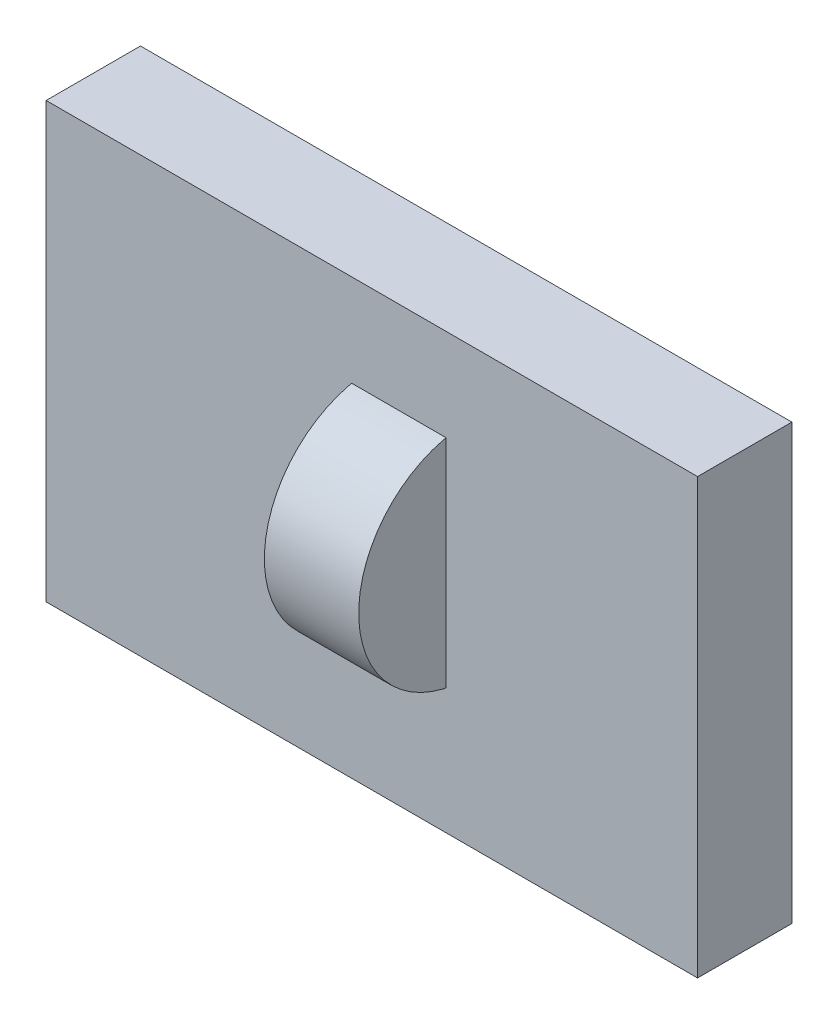
ISO-10303-21;
HEADER;
FILE_DESCRIPTION(('STEP AP214'),'2;1');
FILE_NAME('part.step','',(''),(''),'','','');
FILE_SCHEMA(('AUTOMOTIVE_DESIGN { 1 0 10303 214 1 1 1 1 }'));
ENDSEC;
DATA;
#1=APPLICATION_CONTEXT('core data for automotive mechanical design processes');
#2=APPLICATION_PROTOCOL_DEFINITION('international standard','automotive_design',2000,#1);
#3=PRODUCT_CONTEXT('',#1,'mechanical');
#4=PRODUCT('Part','Part','',(#3));
#5=PRODUCT_RELATED_PRODUCT_CATEGORY('part','',(#4));
#6=PRODUCT_DEFINITION_FORMATION('','',#4);
#7=PRODUCT_DEFINITION_CONTEXT('part definition',#1,'design');
#8=PRODUCT_DEFINITION('design','',#6,#7);
#9=PRODUCT_DEFINITION_SHAPE('','',#8);
#10=(LENGTH_UNIT() NAMED_UNIT(*) SI_UNIT(.MILLI.,.METRE.));
#11=(NAMED_UNIT(*) PLANE_ANGLE_UNIT() SI_UNIT($,.RADIAN.));
#12=(NAMED_UNIT(*) SI_UNIT($,.STERADIAN.) SOLID_ANGLE_UNIT());
#13=UNCERTAINTY_MEASURE_WITH_UNIT(LENGTH_MEASURE(1.E-05),#10,'distance_accuracy_value','');
#14=(GEOMETRIC_REPRESENTATION_CONTEXT(3) GLOBAL_UNCERTAINTY_ASSIGNED_CONTEXT((#13)) GLOBAL_UNIT_ASSIGNED_CONTEXT((#10,
#11,#12)) REPRESENTATION_CONTEXT('',''));
#15=CARTESIAN_POINT('',(0.,0.,0.));
#16=DIRECTION('',(0.,0.,1.));
#17=DIRECTION('',(1.,0.,0.));
#18=AXIS2_PLACEMENT_3D('',#15,#16,#17);
#19=CARTESIAN_POINT('',(10.,0.,-2.49777081928821));
#20=DIRECTION('',(-1.,0.,0.));
#21=DIRECTION('',(0.,0.,1.));
#22=AXIS2_PLACEMENT_3D('',#19,#20,#21);
#23=CYLINDRICAL_SURFACE('',#22,11.76735074313);
#24=CARTESIAN_POINT('',(10.,0.,-2.49777081928821));
#25=DIRECTION('',(1.,0.,0.));
#26=DIRECTION('',(0.,0.,-1.));
#27=AXIS2_PLACEMENT_3D('',#24,#25,#26);
#28=CIRCLE('',#27,11.76735074313);
#29=CARTESIAN_POINT('',(10.,0.,-14.2651215624182));
#30=VERTEX_POINT('',#29);
#31=EDGE_CURVE('E11',#30,#30,#28,.T.);
#32=ORIENTED_EDGE('',*,*,#31,.F.);
#33=EDGE_LOOP('',(#32));
#34=FACE_BOUND('',#33,.T.);
#35=CARTESIAN_POINT('',(0.,0.,-2.49777081928821));
#36=DIRECTION('',(1.,0.,0.));
#37=DIRECTION('',(0.,0.,-1.));
#38=AXIS2_PLACEMENT_3D('',#35,#36,#37);
#39=CIRCLE('',#38,11.76735074313);
#40=CARTESIAN_POINT('',(0.,0.,-14.2651215624182));
#41=VERTEX_POINT('',#40);
#42=EDGE_CURVE('E47',#41,#41,#39,.T.);
#43=ORIENTED_EDGE('',*,*,#42,.T.);
#44=EDGE_LOOP('',(#43));
#45=FACE_BOUND('',#44,.T.);
#46=ADVANCED_FACE('F44',(#34,#45),#23,.T.);
#47=CARTESIAN_POINT('',(10.,0.,-2.49777081928821));
#48=DIRECTION('',(1.,0.,0.));
#49=DIRECTION('',(0.,0.,-1.));
#50=AXIS2_PLACEMENT_3D('',#47,#48,#49);
#51=PLANE('',#50);
#52=ORIENTED_EDGE('',*,*,#31,.T.);
#53=EDGE_LOOP('',(#52));
#54=FACE_BOUND('',#53,.T.);
#55=ADVANCED_FACE('F59',(#54),#51,.T.);
#56=CARTESIAN_POINT('',(0.,0.,-2.49777081928821));
#57=DIRECTION('',(1.,0.,0.));
#58=DIRECTION('',(0.,0.,-1.));
#59=AXIS2_PLACEMENT_3D('',#56,#57,#58);
#60=PLANE('',#59);
#61=ORIENTED_EDGE('',*,*,#42,.F.);
#62=EDGE_LOOP('',(#61));
#63=FACE_BOUND('',#62,.T.);
#64=ADVANCED_FACE('F57',(#63),#60,.F.);
#65=CLOSED_SHELL('',(#46,#55,#64));
#66=MANIFOLD_SOLID_BREP('B2',#65);
#67=CARTESIAN_POINT('',(-32.4073170430545,21.2506997003636,-10.));
#68=DIRECTION('',(-1.,0.,0.));
#69=DIRECTION('',(0.,0.,1.));
#70=AXIS2_PLACEMENT_3D('',#67,#68,#69);
#71=PLANE('',#70);
#72=DIRECTION('',(0.,-1.,0.));
#73=VECTOR('',#72,1.);
#74=CARTESIAN_POINT('',(-32.4073170430545,21.2506997003636,0.));
#75=LINE('',#74,#73);
#76=CARTESIAN_POINT('',(-32.4073170430545,21.2506997003636,0.));
#77=VERTEX_POINT('',#76);
#78=CARTESIAN_POINT('',(-32.4073170430545,-24.7924829837576,0.));
#79=VERTEX_POINT('',#78);
#80=EDGE_CURVE('E148',#77,#79,#75,.T.);
#81=ORIENTED_EDGE('',*,*,#80,.F.);
#82=DIRECTION('',(0.,0.,1.));
#83=VECTOR('',#82,1.);
#84=CARTESIAN_POINT('',(-32.4073170430545,21.2506997003636,-10.));
#85=LINE('',#84,#83);
#86=CARTESIAN_POINT('',(-32.4073170430545,21.2506997003636,-10.));
#87=VERTEX_POINT('',#86);
#88=EDGE_CURVE('E42',#87,#77,#85,.T.);
#89=ORIENTED_EDGE('',*,*,#88,.F.);
#90=DIRECTION('',(0.,-1.,0.));
#91=VECTOR('',#90,1.);
#92=CARTESIAN_POINT('',(-32.4073170430545,21.2506997003636,-10.));
#93=LINE('',#92,#91);
#94=CARTESIAN_POINT('',(-32.4073170430545,-24.7924829837576,-10.));
#95=VERTEX_POINT('',#94);
#96=EDGE_CURVE('E142',#87,#95,#93,.T.);
#97=ORIENTED_EDGE('',*,*,#96,.T.);
#98=DIRECTION('',(0.,0.,1.));
#99=VECTOR('',#98,1.);
#100=CARTESIAN_POINT('',(-32.4073170430545,-24.7924829837576,-10.));
#101=LINE('',#100,#99);
#102=EDGE_CURVE('E87',#95,#79,#101,.T.);
#103=ORIENTED_EDGE('',*,*,#102,.T.);
#104=EDGE_LOOP('',(#81,#89,#97,#103));
#105=FACE_BOUND('',#104,.T.);
#106=ADVANCED_FACE('F84',(#105),#71,.T.);
#107=CARTESIAN_POINT('',(-32.4073170430545,21.2506997003636,-10.));
#108=DIRECTION('',(0.,1.,0.));
#109=DIRECTION('',(0.,0.,1.));
#110=AXIS2_PLACEMENT_3D('',#107,#108,#109);
#111=PLANE('',#110);
#112=DIRECTION('',(-1.,0.,0.));
#113=VECTOR('',#112,1.);
#114=CARTESIAN_POINT('',(-32.4073170430545,21.2506997003636,0.));
#115=LINE('',#114,#113);
#116=CARTESIAN_POINT('',(36.6574569831272,21.2506997003636,0.));
#117=VERTEX_POINT('',#116);
#118=EDGE_CURVE('E144',#117,#77,#115,.T.);
#119=ORIENTED_EDGE('',*,*,#118,.F.);
#120=DIRECTION('',(0.,0.,1.));
#121=VECTOR('',#120,1.);
#122=CARTESIAN_POINT('',(36.6574569831272,21.2506997003636,-10.));
#123=LINE('',#122,#121);
#124=CARTESIAN_POINT('',(36.6574569831272,21.2506997003636,-10.));
#125=VERTEX_POINT('',#124);
#126=EDGE_CURVE('E93',#125,#117,#123,.T.);
#127=ORIENTED_EDGE('',*,*,#126,.F.);
#128=DIRECTION('',(-1.,0.,0.));
#129=VECTOR('',#128,1.);
#130=CARTESIAN_POINT('',(-32.4073170430545,21.2506997003636,-10.));
#131=LINE('',#130,#129);
#132=EDGE_CURVE('E139',#125,#87,#131,.T.);
#133=ORIENTED_EDGE('',*,*,#132,.T.);
#134=ORIENTED_EDGE('',*,*,#88,.T.);
#135=EDGE_LOOP('',(#119,#127,#133,#134));
#136=FACE_BOUND('',#135,.T.);
#137=ADVANCED_FACE('F158',(#136),#111,.T.);
#138=CARTESIAN_POINT('',(36.6574569831272,21.2506997003636,-10.));
#139=DIRECTION('',(1.,0.,0.));
#140=DIRECTION('',(0.,0.,-1.));
#141=AXIS2_PLACEMENT_3D('',#138,#139,#140);
#142=PLANE('',#141);
#143=DIRECTION('',(0.,1.,0.));
#144=VECTOR('',#143,1.);
#145=CARTESIAN_POINT('',(36.6574569831272,21.2506997003636,0.));
#146=LINE('',#145,#144);
#147=CARTESIAN_POINT('',(36.6574569831272,-24.7924829837576,0.));
#148=VERTEX_POINT('',#147);
#149=EDGE_CURVE('E134',#148,#117,#146,.T.);
#150=ORIENTED_EDGE('',*,*,#149,.F.);
#151=DIRECTION('',(0.,0.,1.));
#152=VECTOR('',#151,1.);
#153=CARTESIAN_POINT('',(36.6574569831272,-24.7924829837576,-10.));
#154=LINE('',#153,#152);
#155=CARTESIAN_POINT('',(36.6574569831272,-24.7924829837576,-10.));
#156=VERTEX_POINT('',#155);
#157=EDGE_CURVE('E129',#156,#148,#154,.T.);
#158=ORIENTED_EDGE('',*,*,#157,.F.);
#159=DIRECTION('',(0.,1.,0.));
#160=VECTOR('',#159,1.);
#161=CARTESIAN_POINT('',(36.6574569831272,21.2506997003636,-10.));
#162=LINE('',#161,#160);
#163=EDGE_CURVE('E132',#156,#125,#162,.T.);
#164=ORIENTED_EDGE('',*,*,#163,.T.);
#165=ORIENTED_EDGE('',*,*,#126,.T.);
#166=EDGE_LOOP('',(#150,#158,#164,#165));
#167=FACE_BOUND('',#166,.T.);
#168=ADVANCED_FACE('F131',(#167),#142,.T.);
#169=CARTESIAN_POINT('',(-32.4073170430545,-24.7924829837576,-10.));
#170=DIRECTION('',(0.,-1.,0.));
#171=DIRECTION('',(0.,0.,-1.));
#172=AXIS2_PLACEMENT_3D('',#169,#170,#171);
#173=PLANE('',#172);
#174=DIRECTION('',(1.,0.,0.));
#175=VECTOR('',#174,1.);
#176=CARTESIAN_POINT('',(-32.4073170430545,-24.7924829837576,0.));
#177=LINE('',#176,#175);
#178=EDGE_CURVE('E151',#79,#148,#177,.T.);
#179=ORIENTED_EDGE('',*,*,#178,.F.);
#180=ORIENTED_EDGE('',*,*,#102,.F.);
#181=DIRECTION('',(1.,0.,0.));
#182=VECTOR('',#181,1.);
#183=CARTESIAN_POINT('',(-32.4073170430545,-24.7924829837576,-10.));
#184=LINE('',#183,#182);
#185=EDGE_CURVE('E138',#95,#156,#184,.T.);
#186=ORIENTED_EDGE('',*,*,#185,.T.);
#187=ORIENTED_EDGE('',*,*,#157,.T.);
#188=EDGE_LOOP('',(#179,#180,#186,#187));
#189=FACE_BOUND('',#188,.T.);
#190=ADVANCED_FACE('F141',(#189),#173,.T.);
#191=CARTESIAN_POINT('',(0.,0.,-10.));
#192=DIRECTION('',(0.,0.,1.));
#193=DIRECTION('',(1.,0.,0.));
#194=AXIS2_PLACEMENT_3D('',#191,#192,#193);
#195=PLANE('',#194);
#196=ORIENTED_EDGE('',*,*,#96,.F.);
#197=ORIENTED_EDGE('',*,*,#132,.F.);
#198=ORIENTED_EDGE('',*,*,#163,.F.);
#199=ORIENTED_EDGE('',*,*,#185,.F.);
#200=EDGE_LOOP('',(#196,#197,#198,#199));
#201=FACE_BOUND('',#200,.T.);
#202=ADVANCED_FACE('F137',(#201),#195,.F.);
#203=CARTESIAN_POINT('',(0.,0.,0.));
#204=DIRECTION('',(0.,0.,1.));
#205=DIRECTION('',(1.,0.,0.));
#206=AXIS2_PLACEMENT_3D('',#203,#204,#205);
#207=PLANE('',#206);
#208=ORIENTED_EDGE('',*,*,#80,.T.);
#209=ORIENTED_EDGE('',*,*,#178,.T.);
#210=ORIENTED_EDGE('',*,*,#149,.T.);
#211=ORIENTED_EDGE('',*,*,#118,.T.);
#212=EDGE_LOOP('',(#208,#209,#210,#211));
#213=FACE_BOUND('',#212,.T.);
#214=ADVANCED_FACE('F157',(#213),#207,.T.);
#215=CLOSED_SHELL('',(#106,#137,#168,#190,#202,#214));
#216=MANIFOLD_SOLID_BREP('B6',#215);
#217=ADVANCED_BREP_SHAPE_REPRESENTATION('',(#18,#66,#216),#14);
#218=SHAPE_DEFINITION_REPRESENTATION(#9,#217);
ENDSEC;
END-ISO-10303-21;
